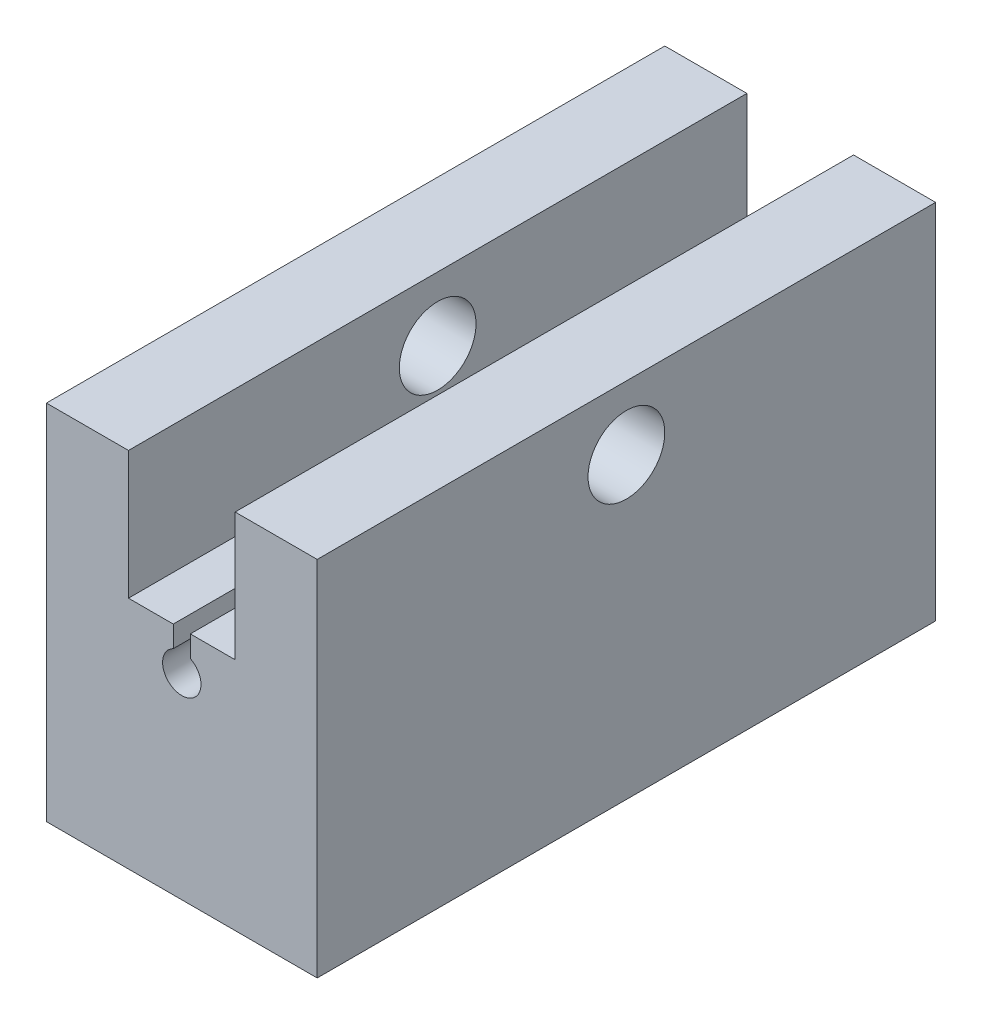
ISO-10303-21;
HEADER;
FILE_DESCRIPTION(('STEP AP214'),'2;1');
FILE_NAME('part.step','',(''),(''),'','','');
FILE_SCHEMA(('AUTOMOTIVE_DESIGN { 1 0 10303 214 1 1 1 1 }'));
ENDSEC;
DATA;
#1=APPLICATION_CONTEXT('core data for automotive mechanical design processes');
#2=APPLICATION_PROTOCOL_DEFINITION('international standard','automotive_design',2000,#1);
#3=PRODUCT_CONTEXT('',#1,'mechanical');
#4=PRODUCT('Part','Part','',(#3));
#5=PRODUCT_RELATED_PRODUCT_CATEGORY('part','',(#4));
#6=PRODUCT_DEFINITION_FORMATION('','',#4);
#7=PRODUCT_DEFINITION_CONTEXT('part definition',#1,'design');
#8=PRODUCT_DEFINITION('design','',#6,#7);
#9=PRODUCT_DEFINITION_SHAPE('','',#8);
#10=(LENGTH_UNIT() NAMED_UNIT(*) SI_UNIT(.MILLI.,.METRE.));
#11=(NAMED_UNIT(*) PLANE_ANGLE_UNIT() SI_UNIT($,.RADIAN.));
#12=(NAMED_UNIT(*) SI_UNIT($,.STERADIAN.) SOLID_ANGLE_UNIT());
#13=UNCERTAINTY_MEASURE_WITH_UNIT(LENGTH_MEASURE(1.E-05),#10,'distance_accuracy_value','');
#14=(GEOMETRIC_REPRESENTATION_CONTEXT(3) GLOBAL_UNCERTAINTY_ASSIGNED_CONTEXT((#13)) GLOBAL_UNIT_ASSIGNED_CONTEXT((#10,
#11,#12)) REPRESENTATION_CONTEXT('',''));
#15=CARTESIAN_POINT('',(0.,0.,0.));
#16=DIRECTION('',(0.,0.,1.));
#17=DIRECTION('',(1.,0.,0.));
#18=AXIS2_PLACEMENT_3D('',#15,#16,#17);
#19=CARTESIAN_POINT('',(37.0257233003559,17.,-14.5));
#20=DIRECTION('',(0.,1.,0.));
#21=DIRECTION('',(0.,0.,1.));
#22=AXIS2_PLACEMENT_3D('',#19,#20,#21);
#23=PLANE('',#22);
#24=DIRECTION('',(0.,0.,-1.));
#25=VECTOR('',#24,1.);
#26=CARTESIAN_POINT('',(2.5,17.,14.5));
#27=LINE('',#26,#25);
#28=CARTESIAN_POINT('',(2.5,17.,14.5));
#29=VERTEX_POINT('',#28);
#30=CARTESIAN_POINT('',(2.5,17.,-14.5));
#31=VERTEX_POINT('',#30);
#32=EDGE_CURVE('E212',#29,#31,#27,.T.);
#33=ORIENTED_EDGE('',*,*,#32,.F.);
#34=DIRECTION('',(-1.,0.,0.));
#35=VECTOR('',#34,1.);
#36=CARTESIAN_POINT('',(37.0257233003559,17.,14.5));
#37=LINE('',#36,#35);
#38=CARTESIAN_POINT('',(6.35,17.,14.5));
#39=VERTEX_POINT('',#38);
#40=EDGE_CURVE('E243',#39,#29,#37,.T.);
#41=ORIENTED_EDGE('',*,*,#40,.F.);
#42=DIRECTION('',(0.,0.,1.));
#43=VECTOR('',#42,1.);
#44=CARTESIAN_POINT('',(6.35,17.,-14.5));
#45=LINE('',#44,#43);
#46=CARTESIAN_POINT('',(6.35,17.,-14.5));
#47=VERTEX_POINT('',#46);
#48=EDGE_CURVE('E229',#47,#39,#45,.T.);
#49=ORIENTED_EDGE('',*,*,#48,.F.);
#50=DIRECTION('',(-1.,0.,0.));
#51=VECTOR('',#50,1.);
#52=CARTESIAN_POINT('',(37.0257233003559,17.,-14.5));
#53=LINE('',#52,#51);
#54=EDGE_CURVE('E234',#47,#31,#53,.T.);
#55=ORIENTED_EDGE('',*,*,#54,.T.);
#56=EDGE_LOOP('',(#33,#41,#49,#55));
#57=FACE_BOUND('',#56,.T.);
#58=ADVANCED_FACE('F45',(#57),#23,.T.);
#59=CARTESIAN_POINT('',(6.35,7.,14.5));
#60=DIRECTION('',(-1.,0.,0.));
#61=DIRECTION('',(0.,0.,1.));
#62=AXIS2_PLACEMENT_3D('',#59,#60,#61);
#63=PLANE('',#62);
#64=CARTESIAN_POINT('',(6.35,14.,0.));
#65=DIRECTION('',(-1.,0.,0.));
#66=DIRECTION('',(0.,0.,1.));
#67=AXIS2_PLACEMENT_3D('',#64,#65,#66);
#68=CIRCLE('',#67,1.8);
#69=CARTESIAN_POINT('',(6.35,14.,1.8));
#70=VERTEX_POINT('',#69);
#71=EDGE_CURVE('E395',#70,#70,#68,.T.);
#72=ORIENTED_EDGE('',*,*,#71,.T.);
#73=EDGE_LOOP('',(#72));
#74=FACE_BOUND('',#73,.T.);
#75=DIRECTION('',(0.,0.,-1.));
#76=VECTOR('',#75,1.);
#77=CARTESIAN_POINT('',(6.35,0.,14.5));
#78=LINE('',#77,#76);
#79=CARTESIAN_POINT('',(6.35,0.,14.5));
#80=VERTEX_POINT('',#79);
#81=CARTESIAN_POINT('',(6.35,0.,-14.5));
#82=VERTEX_POINT('',#81);
#83=EDGE_CURVE('E269',#80,#82,#78,.T.);
#84=ORIENTED_EDGE('',*,*,#83,.T.);
#85=DIRECTION('',(0.,-1.,0.));
#86=VECTOR('',#85,1.);
#87=CARTESIAN_POINT('',(6.35,7.,-14.5));
#88=LINE('',#87,#86);
#89=EDGE_CURVE('E11',#47,#82,#88,.T.);
#90=ORIENTED_EDGE('',*,*,#89,.F.);
#91=ORIENTED_EDGE('',*,*,#48,.T.);
#92=DIRECTION('',(0.,-1.,0.));
#93=VECTOR('',#92,1.);
#94=CARTESIAN_POINT('',(6.35,7.,14.5));
#95=LINE('',#94,#93);
#96=EDGE_CURVE('E281',#39,#80,#95,.T.);
#97=ORIENTED_EDGE('',*,*,#96,.T.);
#98=EDGE_LOOP('',(#84,#90,#91,#97));
#99=FACE_BOUND('',#98,.T.);
#100=ADVANCED_FACE('F301',(#74,#99),#63,.F.);
#101=CARTESIAN_POINT('',(-6.35,7.,-14.5));
#102=DIRECTION('',(0.,0.,1.));
#103=DIRECTION('',(1.,0.,0.));
#104=AXIS2_PLACEMENT_3D('',#101,#102,#103);
#105=PLANE('',#104);
#106=DIRECTION('',(-1.,0.,0.));
#107=VECTOR('',#106,1.);
#108=CARTESIAN_POINT('',(0.4,11.,-14.5));
#109=LINE('',#108,#107);
#110=CARTESIAN_POINT('',(2.5,11.,-14.5));
#111=VERTEX_POINT('',#110);
#112=CARTESIAN_POINT('',(0.4,11.,-14.5));
#113=VERTEX_POINT('',#112);
#114=EDGE_CURVE('E145',#111,#113,#109,.T.);
#115=ORIENTED_EDGE('',*,*,#114,.F.);
#116=DIRECTION('',(0.,-1.,0.));
#117=VECTOR('',#116,1.);
#118=CARTESIAN_POINT('',(2.5,11.,-14.5));
#119=LINE('',#118,#117);
#120=EDGE_CURVE('E164',#31,#111,#119,.T.);
#121=ORIENTED_EDGE('',*,*,#120,.F.);
#122=ORIENTED_EDGE('',*,*,#54,.F.);
#123=ORIENTED_EDGE('',*,*,#89,.T.);
#124=DIRECTION('',(-1.,0.,0.));
#125=VECTOR('',#124,1.);
#126=CARTESIAN_POINT('',(-6.35,0.,-14.5));
#127=LINE('',#126,#125);
#128=CARTESIAN_POINT('',(-6.35,0.,-14.5));
#129=VERTEX_POINT('',#128);
#130=EDGE_CURVE('E273',#82,#129,#127,.T.);
#131=ORIENTED_EDGE('',*,*,#130,.T.);
#132=DIRECTION('',(0.,-1.,0.));
#133=VECTOR('',#132,1.);
#134=CARTESIAN_POINT('',(-6.35,7.,-14.5));
#135=LINE('',#134,#133);
#136=CARTESIAN_POINT('',(-6.35,17.,-14.5));
#137=VERTEX_POINT('',#136);
#138=EDGE_CURVE('E56',#137,#129,#135,.T.);
#139=ORIENTED_EDGE('',*,*,#138,.F.);
#140=CARTESIAN_POINT('',(-2.5,17.,-14.5));
#141=VERTEX_POINT('',#140);
#142=EDGE_CURVE('E242',#141,#137,#53,.T.);
#143=ORIENTED_EDGE('',*,*,#142,.F.);
#144=DIRECTION('',(0.,1.,0.));
#145=VECTOR('',#144,1.);
#146=CARTESIAN_POINT('',(-2.5,17.,-14.5));
#147=LINE('',#146,#145);
#148=CARTESIAN_POINT('',(-2.5,11.,-14.5));
#149=VERTEX_POINT('',#148);
#150=EDGE_CURVE('E63',#149,#141,#147,.T.);
#151=ORIENTED_EDGE('',*,*,#150,.F.);
#152=DIRECTION('',(-1.,0.,0.));
#153=VECTOR('',#152,1.);
#154=CARTESIAN_POINT('',(-2.5,11.,-14.5));
#155=LINE('',#154,#153);
#156=CARTESIAN_POINT('',(-0.4,11.,-14.5));
#157=VERTEX_POINT('',#156);
#158=EDGE_CURVE('E202',#157,#149,#155,.T.);
#159=ORIENTED_EDGE('',*,*,#158,.F.);
#160=DIRECTION('',(0.,1.,0.));
#161=VECTOR('',#160,1.);
#162=CARTESIAN_POINT('',(-0.4,11.,-14.5));
#163=LINE('',#162,#161);
#164=CARTESIAN_POINT('',(-0.4,10.,-14.5));
#165=VERTEX_POINT('',#164);
#166=EDGE_CURVE('E198',#165,#157,#163,.T.);
#167=ORIENTED_EDGE('',*,*,#166,.F.);
#168=CARTESIAN_POINT('',(0.,9.19377422517015,-14.5));
#169=DIRECTION('',(0.,0.,-1.));
#170=DIRECTION('',(-1.,0.,0.));
#171=AXIS2_PLACEMENT_3D('',#168,#169,#170);
#172=CIRCLE('',#171,0.9);
#173=CARTESIAN_POINT('',(0.4,10.,-14.5));
#174=VERTEX_POINT('',#173);
#175=EDGE_CURVE('E194',#174,#165,#172,.T.);
#176=ORIENTED_EDGE('',*,*,#175,.F.);
#177=DIRECTION('',(0.,-1.,0.));
#178=VECTOR('',#177,1.);
#179=CARTESIAN_POINT('',(0.4,11.,-14.5));
#180=LINE('',#179,#178);
#181=EDGE_CURVE('E191',#113,#174,#180,.T.);
#182=ORIENTED_EDGE('',*,*,#181,.F.);
#183=EDGE_LOOP('',(#115,#121,#122,#123,#131,#139,#143,#151,#159,#167,#176,#182));
#184=FACE_BOUND('',#183,.T.);
#185=ADVANCED_FACE('F310',(#184),#105,.F.);
#186=CARTESIAN_POINT('',(-6.35,7.,14.5));
#187=DIRECTION('',(1.,0.,0.));
#188=DIRECTION('',(0.,0.,-1.));
#189=AXIS2_PLACEMENT_3D('',#186,#187,#188);
#190=PLANE('',#189);
#191=CARTESIAN_POINT('',(-6.35,14.,0.));
#192=DIRECTION('',(-1.,0.,0.));
#193=DIRECTION('',(0.,0.,1.));
#194=AXIS2_PLACEMENT_3D('',#191,#192,#193);
#195=CIRCLE('',#194,1.8);
#196=CARTESIAN_POINT('',(-6.35,14.,1.8));
#197=VERTEX_POINT('',#196);
#198=EDGE_CURVE('E393',#197,#197,#195,.T.);
#199=ORIENTED_EDGE('',*,*,#198,.F.);
#200=EDGE_LOOP('',(#199));
#201=FACE_BOUND('',#200,.T.);
#202=DIRECTION('',(0.,0.,1.));
#203=VECTOR('',#202,1.);
#204=CARTESIAN_POINT('',(-6.35,0.,14.5));
#205=LINE('',#204,#203);
#206=CARTESIAN_POINT('',(-6.35,0.,14.5));
#207=VERTEX_POINT('',#206);
#208=EDGE_CURVE('E276',#129,#207,#205,.T.);
#209=ORIENTED_EDGE('',*,*,#208,.T.);
#210=DIRECTION('',(0.,-1.,0.));
#211=VECTOR('',#210,1.);
#212=CARTESIAN_POINT('',(-6.35,7.,14.5));
#213=LINE('',#212,#211);
#214=CARTESIAN_POINT('',(-6.35,17.,14.5));
#215=VERTEX_POINT('',#214);
#216=EDGE_CURVE('E284',#215,#207,#213,.T.);
#217=ORIENTED_EDGE('',*,*,#216,.F.);
#218=DIRECTION('',(0.,0.,-1.));
#219=VECTOR('',#218,1.);
#220=CARTESIAN_POINT('',(-6.35,17.,-14.5));
#221=LINE('',#220,#219);
#222=EDGE_CURVE('E211',#215,#137,#221,.T.);
#223=ORIENTED_EDGE('',*,*,#222,.T.);
#224=ORIENTED_EDGE('',*,*,#138,.T.);
#225=EDGE_LOOP('',(#209,#217,#223,#224));
#226=FACE_BOUND('',#225,.T.);
#227=ADVANCED_FACE('F292',(#201,#226),#190,.F.);
#228=CARTESIAN_POINT('',(-6.35,7.,14.5));
#229=DIRECTION('',(0.,0.,-1.));
#230=DIRECTION('',(-1.,0.,0.));
#231=AXIS2_PLACEMENT_3D('',#228,#229,#230);
#232=PLANE('',#231);
#233=ORIENTED_EDGE('',*,*,#40,.T.);
#234=DIRECTION('',(0.,-1.,0.));
#235=VECTOR('',#234,1.);
#236=CARTESIAN_POINT('',(2.5,11.,14.5));
#237=LINE('',#236,#235);
#238=CARTESIAN_POINT('',(2.5,11.,14.5));
#239=VERTEX_POINT('',#238);
#240=EDGE_CURVE('E151',#29,#239,#237,.T.);
#241=ORIENTED_EDGE('',*,*,#240,.T.);
#242=DIRECTION('',(-1.,0.,0.));
#243=VECTOR('',#242,1.);
#244=CARTESIAN_POINT('',(0.4,11.,14.5));
#245=LINE('',#244,#243);
#246=CARTESIAN_POINT('',(0.4,11.,14.5));
#247=VERTEX_POINT('',#246);
#248=EDGE_CURVE('E142',#239,#247,#245,.T.);
#249=ORIENTED_EDGE('',*,*,#248,.T.);
#250=DIRECTION('',(0.,-1.,0.));
#251=VECTOR('',#250,1.);
#252=CARTESIAN_POINT('',(0.4,11.,14.5));
#253=LINE('',#252,#251);
#254=CARTESIAN_POINT('',(0.4,10.,14.5));
#255=VERTEX_POINT('',#254);
#256=EDGE_CURVE('E154',#247,#255,#253,.T.);
#257=ORIENTED_EDGE('',*,*,#256,.T.);
#258=CARTESIAN_POINT('',(0.,9.19377422517015,14.5));
#259=DIRECTION('',(0.,0.,-1.));
#260=DIRECTION('',(-1.,0.,0.));
#261=AXIS2_PLACEMENT_3D('',#258,#259,#260);
#262=CIRCLE('',#261,0.9);
#263=CARTESIAN_POINT('',(-0.4,10.,14.5));
#264=VERTEX_POINT('',#263);
#265=EDGE_CURVE('E159',#255,#264,#262,.T.);
#266=ORIENTED_EDGE('',*,*,#265,.T.);
#267=DIRECTION('',(0.,1.,0.));
#268=VECTOR('',#267,1.);
#269=CARTESIAN_POINT('',(-0.4,11.,14.5));
#270=LINE('',#269,#268);
#271=CARTESIAN_POINT('',(-0.4,11.,14.5));
#272=VERTEX_POINT('',#271);
#273=EDGE_CURVE('E175',#264,#272,#270,.T.);
#274=ORIENTED_EDGE('',*,*,#273,.T.);
#275=DIRECTION('',(-1.,0.,0.));
#276=VECTOR('',#275,1.);
#277=CARTESIAN_POINT('',(-2.5,11.,14.5));
#278=LINE('',#277,#276);
#279=CARTESIAN_POINT('',(-2.5,11.,14.5));
#280=VERTEX_POINT('',#279);
#281=EDGE_CURVE('E179',#272,#280,#278,.T.);
#282=ORIENTED_EDGE('',*,*,#281,.T.);
#283=DIRECTION('',(0.,1.,0.));
#284=VECTOR('',#283,1.);
#285=CARTESIAN_POINT('',(-2.5,17.,14.5));
#286=LINE('',#285,#284);
#287=CARTESIAN_POINT('',(-2.5,17.,14.5));
#288=VERTEX_POINT('',#287);
#289=EDGE_CURVE('E183',#280,#288,#286,.T.);
#290=ORIENTED_EDGE('',*,*,#289,.T.);
#291=EDGE_CURVE('E238',#288,#215,#37,.T.);
#292=ORIENTED_EDGE('',*,*,#291,.T.);
#293=ORIENTED_EDGE('',*,*,#216,.T.);
#294=DIRECTION('',(1.,0.,0.));
#295=VECTOR('',#294,1.);
#296=CARTESIAN_POINT('',(-6.35,0.,14.5));
#297=LINE('',#296,#295);
#298=EDGE_CURVE('E71',#207,#80,#297,.T.);
#299=ORIENTED_EDGE('',*,*,#298,.T.);
#300=ORIENTED_EDGE('',*,*,#96,.F.);
#301=EDGE_LOOP('',(#233,#241,#249,#257,#266,#274,#282,#290,#292,#293,#299,#300));
#302=FACE_BOUND('',#301,.T.);
#303=ADVANCED_FACE('F162',(#302),#232,.F.);
#304=CARTESIAN_POINT('',(0.,0.,0.));
#305=DIRECTION('',(0.,-1.,0.));
#306=DIRECTION('',(0.,0.,-1.));
#307=AXIS2_PLACEMENT_3D('',#304,#305,#306);
#308=PLANE('',#307);
#309=CARTESIAN_POINT('',(0.,0.,7.5));
#310=DIRECTION('',(0.,-1.,0.));
#311=DIRECTION('',(0.,0.,-1.));
#312=AXIS2_PLACEMENT_3D('',#309,#310,#311);
#313=CIRCLE('',#312,3.00000000000001);
#314=CARTESIAN_POINT('',(0.,0.,4.49999999999999));
#315=VERTEX_POINT('',#314);
#316=EDGE_CURVE('E233',#315,#315,#313,.T.);
#317=ORIENTED_EDGE('',*,*,#316,.F.);
#318=EDGE_LOOP('',(#317));
#319=FACE_BOUND('',#318,.T.);
#320=CARTESIAN_POINT('',(0.,0.,-7.5));
#321=DIRECTION('',(0.,-1.,0.));
#322=DIRECTION('',(0.,0.,-1.));
#323=AXIS2_PLACEMENT_3D('',#320,#321,#322);
#324=CIRCLE('',#323,3.00000000000001);
#325=CARTESIAN_POINT('',(0.,0.,-10.5));
#326=VERTEX_POINT('',#325);
#327=EDGE_CURVE('E257',#326,#326,#324,.T.);
#328=ORIENTED_EDGE('',*,*,#327,.F.);
#329=EDGE_LOOP('',(#328));
#330=FACE_BOUND('',#329,.T.);
#331=ORIENTED_EDGE('',*,*,#83,.F.);
#332=ORIENTED_EDGE('',*,*,#298,.F.);
#333=ORIENTED_EDGE('',*,*,#208,.F.);
#334=ORIENTED_EDGE('',*,*,#130,.F.);
#335=EDGE_LOOP('',(#331,#332,#333,#334));
#336=FACE_BOUND('',#335,.T.);
#337=ADVANCED_FACE('F299',(#319,#330,#336),#308,.T.);
#338=CARTESIAN_POINT('',(0.,0.,-7.5));
#339=DIRECTION('',(0.,-1.,0.));
#340=DIRECTION('',(0.,0.,-1.));
#341=AXIS2_PLACEMENT_3D('',#338,#339,#340);
#342=CYLINDRICAL_SURFACE('',#341,2.80000000000001);
#343=CARTESIAN_POINT('',(0.,7.,-7.5));
#344=DIRECTION('',(0.,-1.,0.));
#345=DIRECTION('',(0.,0.,-1.));
#346=AXIS2_PLACEMENT_3D('',#343,#344,#345);
#347=CIRCLE('',#346,2.80000000000001);
#348=CARTESIAN_POINT('',(0.,7.,-10.3));
#349=VERTEX_POINT('',#348);
#350=EDGE_CURVE('E265',#349,#349,#347,.T.);
#351=ORIENTED_EDGE('',*,*,#350,.F.);
#352=EDGE_LOOP('',(#351));
#353=FACE_BOUND('',#352,.T.);
#354=CARTESIAN_POINT('',(0.,6.,-7.5));
#355=DIRECTION('',(0.,-1.,0.));
#356=DIRECTION('',(0.,0.,-1.));
#357=AXIS2_PLACEMENT_3D('',#354,#355,#356);
#358=CIRCLE('',#357,2.80000000000001);
#359=CARTESIAN_POINT('',(0.,6.,-10.3));
#360=VERTEX_POINT('',#359);
#361=EDGE_CURVE('E261',#360,#360,#358,.T.);
#362=ORIENTED_EDGE('',*,*,#361,.T.);
#363=EDGE_LOOP('',(#362));
#364=FACE_BOUND('',#363,.T.);
#365=ADVANCED_FACE('F371',(#353,#364),#342,.F.);
#366=CARTESIAN_POINT('',(0.,0.,7.5));
#367=DIRECTION('',(0.,-1.,0.));
#368=DIRECTION('',(0.,0.,-1.));
#369=AXIS2_PLACEMENT_3D('',#366,#367,#368);
#370=CYLINDRICAL_SURFACE('',#369,2.80000000000001);
#371=CARTESIAN_POINT('',(0.,7.,7.5));
#372=DIRECTION('',(0.,-1.,0.));
#373=DIRECTION('',(0.,0.,-1.));
#374=AXIS2_PLACEMENT_3D('',#371,#372,#373);
#375=CIRCLE('',#374,2.80000000000001);
#376=CARTESIAN_POINT('',(0.,7.,4.69999999999999));
#377=VERTEX_POINT('',#376);
#378=EDGE_CURVE('E253',#377,#377,#375,.T.);
#379=ORIENTED_EDGE('',*,*,#378,.F.);
#380=EDGE_LOOP('',(#379));
#381=FACE_BOUND('',#380,.T.);
#382=CARTESIAN_POINT('',(0.,6.,7.5));
#383=DIRECTION('',(0.,-1.,0.));
#384=DIRECTION('',(0.,0.,-1.));
#385=AXIS2_PLACEMENT_3D('',#382,#383,#384);
#386=CIRCLE('',#385,2.80000000000001);
#387=CARTESIAN_POINT('',(0.,6.,4.69999999999999));
#388=VERTEX_POINT('',#387);
#389=EDGE_CURVE('E249',#388,#388,#386,.T.);
#390=ORIENTED_EDGE('',*,*,#389,.T.);
#391=EDGE_LOOP('',(#390));
#392=FACE_BOUND('',#391,.T.);
#393=ADVANCED_FACE('F373',(#381,#392),#370,.F.);
#394=CARTESIAN_POINT('',(37.0257233003559,7.,-14.5));
#395=DIRECTION('',(0.,-1.,0.));
#396=DIRECTION('',(0.,0.,-1.));
#397=AXIS2_PLACEMENT_3D('',#394,#395,#396);
#398=PLANE('',#397);
#399=ORIENTED_EDGE('',*,*,#350,.T.);
#400=EDGE_LOOP('',(#399));
#401=FACE_BOUND('',#400,.T.);
#402=ADVANCED_FACE('F337',(#401),#398,.T.);
#403=ORIENTED_EDGE('',*,*,#378,.T.);
#404=EDGE_LOOP('',(#403));
#405=FACE_BOUND('',#404,.T.);
#406=ADVANCED_FACE('F330',(#405),#398,.T.);
#407=DIRECTION('',(0.,0.,-1.));
#408=VECTOR('',#407,1.);
#409=CARTESIAN_POINT('',(-2.5,17.,14.5));
#410=LINE('',#409,#408);
#411=EDGE_CURVE('E215',#288,#141,#410,.T.);
#412=ORIENTED_EDGE('',*,*,#411,.T.);
#413=ORIENTED_EDGE('',*,*,#142,.T.);
#414=ORIENTED_EDGE('',*,*,#222,.F.);
#415=ORIENTED_EDGE('',*,*,#291,.F.);
#416=EDGE_LOOP('',(#412,#413,#414,#415));
#417=FACE_BOUND('',#416,.T.);
#418=ADVANCED_FACE('F326',(#417),#23,.T.);
#419=CARTESIAN_POINT('',(0.4,11.,14.5));
#420=DIRECTION('',(0.,-1.,0.));
#421=DIRECTION('',(1.,0.,0.));
#422=AXIS2_PLACEMENT_3D('',#419,#420,#421);
#423=PLANE('',#422);
#424=ORIENTED_EDGE('',*,*,#114,.T.);
#425=DIRECTION('',(0.,0.,-1.));
#426=VECTOR('',#425,1.);
#427=CARTESIAN_POINT('',(0.4,11.,14.5));
#428=LINE('',#427,#426);
#429=EDGE_CURVE('E138',#247,#113,#428,.T.);
#430=ORIENTED_EDGE('',*,*,#429,.F.);
#431=ORIENTED_EDGE('',*,*,#248,.F.);
#432=DIRECTION('',(0.,0.,-1.));
#433=VECTOR('',#432,1.);
#434=CARTESIAN_POINT('',(2.5,11.,14.5));
#435=LINE('',#434,#433);
#436=EDGE_CURVE('E208',#239,#111,#435,.T.);
#437=ORIENTED_EDGE('',*,*,#436,.T.);
#438=EDGE_LOOP('',(#424,#430,#431,#437));
#439=FACE_BOUND('',#438,.T.);
#440=ADVANCED_FACE('F140',(#439),#423,.F.);
#441=CARTESIAN_POINT('',(2.5,11.,14.5));
#442=DIRECTION('',(1.,0.,0.));
#443=DIRECTION('',(0.,1.,0.));
#444=AXIS2_PLACEMENT_3D('',#441,#442,#443);
#445=PLANE('',#444);
#446=CARTESIAN_POINT('',(2.5,14.,0.));
#447=DIRECTION('',(1.,0.,0.));
#448=DIRECTION('',(0.,1.,0.));
#449=AXIS2_PLACEMENT_3D('',#446,#447,#448);
#450=CIRCLE('',#449,1.8);
#451=CARTESIAN_POINT('',(2.5,15.8,0.));
#452=VERTEX_POINT('',#451);
#453=EDGE_CURVE('E50',#452,#452,#450,.T.);
#454=ORIENTED_EDGE('',*,*,#453,.T.);
#455=EDGE_LOOP('',(#454));
#456=FACE_BOUND('',#455,.T.);
#457=ORIENTED_EDGE('',*,*,#120,.T.);
#458=ORIENTED_EDGE('',*,*,#436,.F.);
#459=ORIENTED_EDGE('',*,*,#240,.F.);
#460=ORIENTED_EDGE('',*,*,#32,.T.);
#461=EDGE_LOOP('',(#457,#458,#459,#460));
#462=FACE_BOUND('',#461,.T.);
#463=ADVANCED_FACE('F309',(#456,#462),#445,.F.);
#464=CARTESIAN_POINT('',(-2.5,17.,14.5));
#465=DIRECTION('',(-1.,0.,0.));
#466=DIRECTION('',(0.,-1.,0.));
#467=AXIS2_PLACEMENT_3D('',#464,#465,#466);
#468=PLANE('',#467);
#469=CARTESIAN_POINT('',(-2.5,14.,0.));
#470=DIRECTION('',(-1.,0.,0.));
#471=DIRECTION('',(0.,-1.,0.));
#472=AXIS2_PLACEMENT_3D('',#469,#470,#471);
#473=CIRCLE('',#472,1.8);
#474=CARTESIAN_POINT('',(-2.5,12.2,0.));
#475=VERTEX_POINT('',#474);
#476=EDGE_CURVE('E170',#475,#475,#473,.T.);
#477=ORIENTED_EDGE('',*,*,#476,.T.);
#478=EDGE_LOOP('',(#477));
#479=FACE_BOUND('',#478,.T.);
#480=ORIENTED_EDGE('',*,*,#150,.T.);
#481=ORIENTED_EDGE('',*,*,#411,.F.);
#482=ORIENTED_EDGE('',*,*,#289,.F.);
#483=DIRECTION('',(0.,0.,-1.));
#484=VECTOR('',#483,1.);
#485=CARTESIAN_POINT('',(-2.5,11.,14.5));
#486=LINE('',#485,#484);
#487=EDGE_CURVE('E218',#280,#149,#486,.T.);
#488=ORIENTED_EDGE('',*,*,#487,.T.);
#489=EDGE_LOOP('',(#480,#481,#482,#488));
#490=FACE_BOUND('',#489,.T.);
#491=ADVANCED_FACE('F323',(#479,#490),#468,.F.);
#492=CARTESIAN_POINT('',(-2.5,11.,14.5));
#493=DIRECTION('',(0.,-1.,0.));
#494=DIRECTION('',(1.,0.,0.));
#495=AXIS2_PLACEMENT_3D('',#492,#493,#494);
#496=PLANE('',#495);
#497=ORIENTED_EDGE('',*,*,#158,.T.);
#498=ORIENTED_EDGE('',*,*,#487,.F.);
#499=ORIENTED_EDGE('',*,*,#281,.F.);
#500=DIRECTION('',(0.,0.,-1.));
#501=VECTOR('',#500,1.);
#502=CARTESIAN_POINT('',(-0.4,11.,14.5));
#503=LINE('',#502,#501);
#504=EDGE_CURVE('E221',#272,#157,#503,.T.);
#505=ORIENTED_EDGE('',*,*,#504,.T.);
#506=EDGE_LOOP('',(#497,#498,#499,#505));
#507=FACE_BOUND('',#506,.T.);
#508=ADVANCED_FACE('F321',(#507),#496,.F.);
#509=CARTESIAN_POINT('',(-0.4,11.,14.5));
#510=DIRECTION('',(-1.,0.,0.));
#511=DIRECTION('',(0.,-1.,0.));
#512=AXIS2_PLACEMENT_3D('',#509,#510,#511);
#513=PLANE('',#512);
#514=ORIENTED_EDGE('',*,*,#166,.T.);
#515=ORIENTED_EDGE('',*,*,#504,.F.);
#516=ORIENTED_EDGE('',*,*,#273,.F.);
#517=DIRECTION('',(0.,0.,-1.));
#518=VECTOR('',#517,1.);
#519=CARTESIAN_POINT('',(-0.4,10.,14.5));
#520=LINE('',#519,#518);
#521=EDGE_CURVE('E224',#264,#165,#520,.T.);
#522=ORIENTED_EDGE('',*,*,#521,.T.);
#523=EDGE_LOOP('',(#514,#515,#516,#522));
#524=FACE_BOUND('',#523,.T.);
#525=ADVANCED_FACE('F319',(#524),#513,.F.);
#526=CARTESIAN_POINT('',(0.,9.19377422517015,14.5));
#527=DIRECTION('',(0.,0.,-1.));
#528=DIRECTION('',(-1.,0.,0.));
#529=AXIS2_PLACEMENT_3D('',#526,#527,#528);
#530=CYLINDRICAL_SURFACE('',#529,0.9);
#531=ORIENTED_EDGE('',*,*,#175,.T.);
#532=ORIENTED_EDGE('',*,*,#521,.F.);
#533=ORIENTED_EDGE('',*,*,#265,.F.);
#534=DIRECTION('',(0.,0.,-1.));
#535=VECTOR('',#534,1.);
#536=CARTESIAN_POINT('',(0.4,10.,14.5));
#537=LINE('',#536,#535);
#538=EDGE_CURVE('E150',#255,#174,#537,.T.);
#539=ORIENTED_EDGE('',*,*,#538,.T.);
#540=EDGE_LOOP('',(#531,#532,#533,#539));
#541=FACE_BOUND('',#540,.T.);
#542=ADVANCED_FACE('F315',(#541),#530,.F.);
#543=CARTESIAN_POINT('',(0.4,11.,14.5));
#544=DIRECTION('',(1.,0.,0.));
#545=DIRECTION('',(0.,1.,0.));
#546=AXIS2_PLACEMENT_3D('',#543,#544,#545);
#547=PLANE('',#546);
#548=ORIENTED_EDGE('',*,*,#181,.T.);
#549=ORIENTED_EDGE('',*,*,#538,.F.);
#550=ORIENTED_EDGE('',*,*,#256,.F.);
#551=ORIENTED_EDGE('',*,*,#429,.T.);
#552=EDGE_LOOP('',(#548,#549,#550,#551));
#553=FACE_BOUND('',#552,.T.);
#554=ADVANCED_FACE('F155',(#553),#547,.F.);
#555=CARTESIAN_POINT('',(-6.35,14.,0.));
#556=DIRECTION('',(-1.,0.,0.));
#557=DIRECTION('',(0.,0.,1.));
#558=AXIS2_PLACEMENT_3D('',#555,#556,#557);
#559=CYLINDRICAL_SURFACE('',#558,1.8);
#560=ORIENTED_EDGE('',*,*,#71,.F.);
#561=EDGE_LOOP('',(#560));
#562=FACE_BOUND('',#561,.T.);
#563=ORIENTED_EDGE('',*,*,#453,.F.);
#564=EDGE_LOOP('',(#563));
#565=FACE_BOUND('',#564,.T.);
#566=ADVANCED_FACE('F364',(#562,#565),#559,.F.);
#567=ORIENTED_EDGE('',*,*,#198,.T.);
#568=EDGE_LOOP('',(#567));
#569=FACE_BOUND('',#568,.T.);
#570=ORIENTED_EDGE('',*,*,#476,.F.);
#571=EDGE_LOOP('',(#570));
#572=FACE_BOUND('',#571,.T.);
#573=ADVANCED_FACE('F357',(#569,#572),#559,.F.);
#574=CARTESIAN_POINT('',(0.,6.,-7.5));
#575=DIRECTION('',(0.,-1.,0.));
#576=DIRECTION('',(0.,0.,-1.));
#577=AXIS2_PLACEMENT_3D('',#574,#575,#576);
#578=CONICAL_SURFACE('',#577,2.79999999999993,0.0333209958782505);
#579=ORIENTED_EDGE('',*,*,#327,.T.);
#580=EDGE_LOOP('',(#579));
#581=FACE_BOUND('',#580,.T.);
#582=ORIENTED_EDGE('',*,*,#361,.F.);
#583=EDGE_LOOP('',(#582));
#584=FACE_BOUND('',#583,.T.);
#585=ADVANCED_FACE('F353',(#581,#584),#578,.F.);
#586=CARTESIAN_POINT('',(0.,6.,7.5));
#587=DIRECTION('',(0.,-1.,0.));
#588=DIRECTION('',(0.,0.,-1.));
#589=AXIS2_PLACEMENT_3D('',#586,#587,#588);
#590=CONICAL_SURFACE('',#589,2.80000000000011,0.033320995878251);
#591=ORIENTED_EDGE('',*,*,#316,.T.);
#592=EDGE_LOOP('',(#591));
#593=FACE_BOUND('',#592,.T.);
#594=ORIENTED_EDGE('',*,*,#389,.F.);
#595=EDGE_LOOP('',(#594));
#596=FACE_BOUND('',#595,.T.);
#597=ADVANCED_FACE('F48',(#593,#596),#590,.F.);
#598=CLOSED_SHELL('',(#58,#100,#185,#227,#303,#337,#365,#393,#402,#406,#418,#440,#463,#491,#508,
#525,#542,#554,#566,#573,#585,#597));
#599=MANIFOLD_SOLID_BREP('B2',#598);
#600=ADVANCED_BREP_SHAPE_REPRESENTATION('',(#18,#599),#14);
#601=SHAPE_DEFINITION_REPRESENTATION(#9,#600);
ENDSEC;
END-ISO-10303-21;
